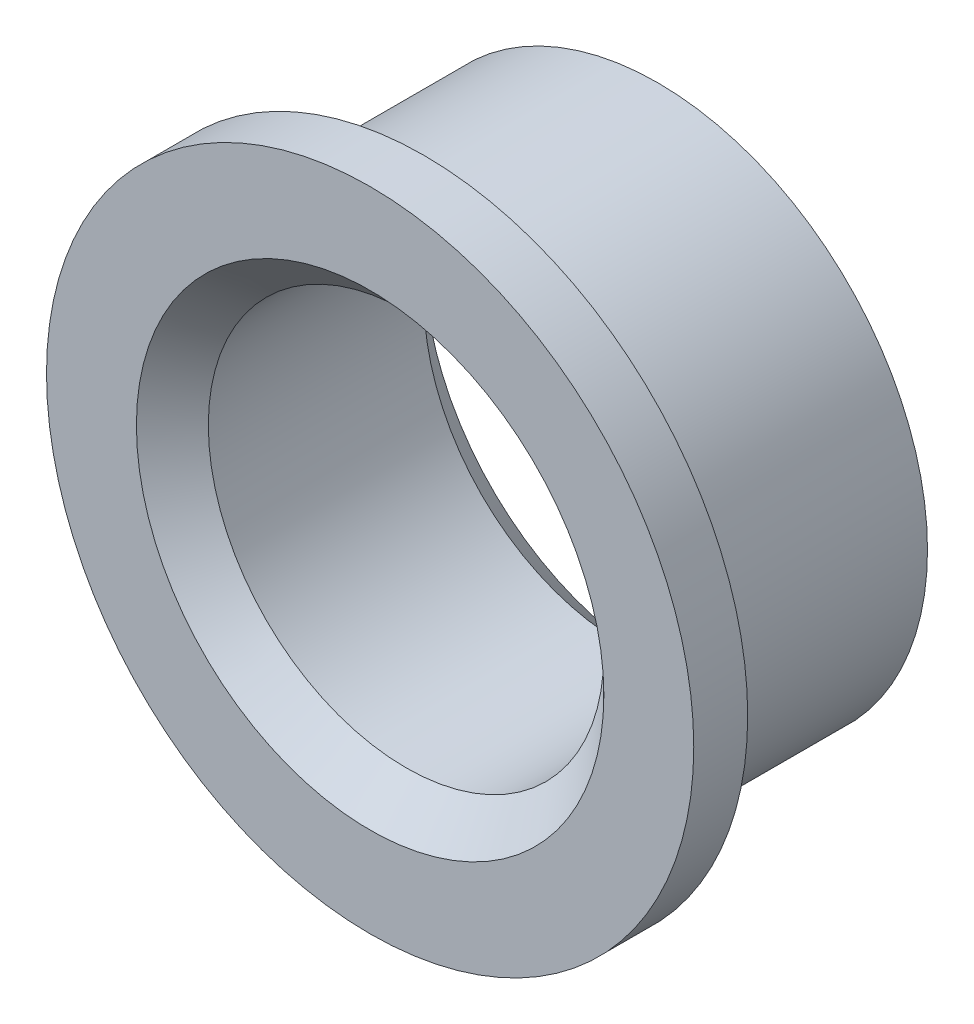
ISO-10303-21;
HEADER;
FILE_DESCRIPTION(('STEP AP214'),'2;1');
FILE_NAME('part.step','',(''),(''),'','','');
FILE_SCHEMA(('AUTOMOTIVE_DESIGN { 1 0 10303 214 1 1 1 1 }'));
ENDSEC;
DATA;
#1=APPLICATION_CONTEXT('core data for automotive mechanical design processes');
#2=APPLICATION_PROTOCOL_DEFINITION('international standard','automotive_design',2000,#1);
#3=PRODUCT_CONTEXT('',#1,'mechanical');
#4=PRODUCT('Part','Part','',(#3));
#5=PRODUCT_RELATED_PRODUCT_CATEGORY('part','',(#4));
#6=PRODUCT_DEFINITION_FORMATION('','',#4);
#7=PRODUCT_DEFINITION_CONTEXT('part definition',#1,'design');
#8=PRODUCT_DEFINITION('design','',#6,#7);
#9=PRODUCT_DEFINITION_SHAPE('','',#8);
#10=(LENGTH_UNIT() NAMED_UNIT(*) SI_UNIT(.MILLI.,.METRE.));
#11=(NAMED_UNIT(*) PLANE_ANGLE_UNIT() SI_UNIT($,.RADIAN.));
#12=(NAMED_UNIT(*) SI_UNIT($,.STERADIAN.) SOLID_ANGLE_UNIT());
#13=UNCERTAINTY_MEASURE_WITH_UNIT(LENGTH_MEASURE(1.E-05),#10,'distance_accuracy_value','');
#14=(GEOMETRIC_REPRESENTATION_CONTEXT(3) GLOBAL_UNCERTAINTY_ASSIGNED_CONTEXT((#13)) GLOBAL_UNIT_ASSIGNED_CONTEXT((#10,
#11,#12)) REPRESENTATION_CONTEXT('',''));
#15=CARTESIAN_POINT('',(0.,0.,0.));
#16=DIRECTION('',(0.,0.,1.));
#17=DIRECTION('',(1.,0.,0.));
#18=AXIS2_PLACEMENT_3D('',#15,#16,#17);
#19=CARTESIAN_POINT('',(0.,7.5,-8.));
#20=DIRECTION('',(0.,0.,1.));
#21=DIRECTION('',(1.,0.,0.));
#22=AXIS2_PLACEMENT_3D('',#19,#20,#21);
#23=PLANE('',#22);
#24=CARTESIAN_POINT('',(0.,0.,-8.));
#25=DIRECTION('',(0.,0.,1.));
#26=DIRECTION('',(1.,0.,0.));
#27=AXIS2_PLACEMENT_3D('',#24,#25,#26);
#28=CIRCLE('',#27,6.5);
#29=CARTESIAN_POINT('',(6.5,0.,-8.));
#30=VERTEX_POINT('',#29);
#31=EDGE_CURVE('E60',#30,#30,#28,.T.);
#32=ORIENTED_EDGE('',*,*,#31,.T.);
#33=EDGE_LOOP('',(#32));
#34=FACE_BOUND('',#33,.T.);
#35=CARTESIAN_POINT('',(0.,0.,-8.));
#36=DIRECTION('',(0.,0.,1.));
#37=DIRECTION('',(1.,0.,0.));
#38=AXIS2_PLACEMENT_3D('',#35,#36,#37);
#39=CIRCLE('',#38,7.5);
#40=CARTESIAN_POINT('',(7.5,0.,-8.));
#41=VERTEX_POINT('',#40);
#42=EDGE_CURVE('E78',#41,#41,#39,.T.);
#43=ORIENTED_EDGE('',*,*,#42,.F.);
#44=EDGE_LOOP('',(#43));
#45=FACE_BOUND('',#44,.T.);
#46=ADVANCED_FACE('F41',(#34,#45),#23,.F.);
#47=CARTESIAN_POINT('',(0.,0.,0.));
#48=DIRECTION('',(0.,0.,1.));
#49=DIRECTION('',(1.,0.,0.));
#50=AXIS2_PLACEMENT_3D('',#47,#48,#49);
#51=CYLINDRICAL_SURFACE('',#50,5.5);
#52=CARTESIAN_POINT('',(0.,0.,-6.99999999999999));
#53=DIRECTION('',(0.,0.,1.));
#54=DIRECTION('',(1.,0.,0.));
#55=AXIS2_PLACEMENT_3D('',#52,#53,#54);
#56=CIRCLE('',#55,5.5);
#57=CARTESIAN_POINT('',(5.5,0.,-6.99999999999999));
#58=VERTEX_POINT('',#57);
#59=EDGE_CURVE('E50',#58,#58,#56,.F.);
#60=ORIENTED_EDGE('',*,*,#59,.T.);
#61=EDGE_LOOP('',(#60));
#62=FACE_BOUND('',#61,.T.);
#63=CARTESIAN_POINT('',(0.,0.,-1.));
#64=DIRECTION('',(0.,0.,-1.));
#65=DIRECTION('',(-1.,0.,0.));
#66=AXIS2_PLACEMENT_3D('',#63,#64,#65);
#67=CIRCLE('',#66,5.5);
#68=CARTESIAN_POINT('',(-5.5,0.,-1.));
#69=VERTEX_POINT('',#68);
#70=EDGE_CURVE('E55',#69,#69,#67,.F.);
#71=ORIENTED_EDGE('',*,*,#70,.T.);
#72=EDGE_LOOP('',(#71));
#73=FACE_BOUND('',#72,.T.);
#74=ADVANCED_FACE('F86',(#62,#73),#51,.F.);
#75=CARTESIAN_POINT('',(0.,5.5,0.));
#76=DIRECTION('',(0.,0.,-1.));
#77=DIRECTION('',(-1.,0.,0.));
#78=AXIS2_PLACEMENT_3D('',#75,#76,#77);
#79=PLANE('',#78);
#80=CARTESIAN_POINT('',(0.,0.,0.));
#81=DIRECTION('',(0.,0.,-1.));
#82=DIRECTION('',(-1.,0.,0.));
#83=AXIS2_PLACEMENT_3D('',#80,#81,#82);
#84=CIRCLE('',#83,6.5);
#85=CARTESIAN_POINT('',(-6.5,0.,0.));
#86=VERTEX_POINT('',#85);
#87=EDGE_CURVE('E10',#86,#86,#84,.T.);
#88=ORIENTED_EDGE('',*,*,#87,.T.);
#89=EDGE_LOOP('',(#88));
#90=FACE_BOUND('',#89,.T.);
#91=CARTESIAN_POINT('',(0.,0.,0.));
#92=DIRECTION('',(0.,0.,1.));
#93=DIRECTION('',(1.,0.,0.));
#94=AXIS2_PLACEMENT_3D('',#91,#92,#93);
#95=CIRCLE('',#94,9.);
#96=CARTESIAN_POINT('',(9.,0.,0.));
#97=VERTEX_POINT('',#96);
#98=EDGE_CURVE('E66',#97,#97,#95,.T.);
#99=ORIENTED_EDGE('',*,*,#98,.T.);
#100=EDGE_LOOP('',(#99));
#101=FACE_BOUND('',#100,.T.);
#102=ADVANCED_FACE('F92',(#90,#101),#79,.F.);
#103=CARTESIAN_POINT('',(0.,0.,0.));
#104=DIRECTION('',(0.,0.,1.));
#105=DIRECTION('',(1.,0.,0.));
#106=AXIS2_PLACEMENT_3D('',#103,#104,#105);
#107=CYLINDRICAL_SURFACE('',#106,9.);
#108=ORIENTED_EDGE('',*,*,#98,.F.);
#109=EDGE_LOOP('',(#108));
#110=FACE_BOUND('',#109,.T.);
#111=CARTESIAN_POINT('',(0.,0.,-1.5));
#112=DIRECTION('',(0.,0.,1.));
#113=DIRECTION('',(1.,0.,0.));
#114=AXIS2_PLACEMENT_3D('',#111,#112,#113);
#115=CIRCLE('',#114,9.);
#116=CARTESIAN_POINT('',(9.,0.,-1.5));
#117=VERTEX_POINT('',#116);
#118=EDGE_CURVE('E70',#117,#117,#115,.T.);
#119=ORIENTED_EDGE('',*,*,#118,.T.);
#120=EDGE_LOOP('',(#119));
#121=FACE_BOUND('',#120,.T.);
#122=ADVANCED_FACE('F114',(#110,#121),#107,.T.);
#123=CARTESIAN_POINT('',(0.,9.,-1.5));
#124=DIRECTION('',(0.,0.,1.));
#125=DIRECTION('',(1.,0.,0.));
#126=AXIS2_PLACEMENT_3D('',#123,#124,#125);
#127=PLANE('',#126);
#128=ORIENTED_EDGE('',*,*,#118,.F.);
#129=EDGE_LOOP('',(#128));
#130=FACE_BOUND('',#129,.T.);
#131=CARTESIAN_POINT('',(0.,0.,-1.5));
#132=DIRECTION('',(0.,0.,1.));
#133=DIRECTION('',(1.,0.,0.));
#134=AXIS2_PLACEMENT_3D('',#131,#132,#133);
#135=CIRCLE('',#134,7.5);
#136=CARTESIAN_POINT('',(7.5,0.,-1.5));
#137=VERTEX_POINT('',#136);
#138=EDGE_CURVE('E74',#137,#137,#135,.T.);
#139=ORIENTED_EDGE('',*,*,#138,.T.);
#140=EDGE_LOOP('',(#139));
#141=FACE_BOUND('',#140,.T.);
#142=ADVANCED_FACE('F106',(#130,#141),#127,.F.);
#143=CARTESIAN_POINT('',(0.,0.,0.));
#144=DIRECTION('',(0.,0.,1.));
#145=DIRECTION('',(1.,0.,0.));
#146=AXIS2_PLACEMENT_3D('',#143,#144,#145);
#147=CYLINDRICAL_SURFACE('',#146,7.5);
#148=ORIENTED_EDGE('',*,*,#138,.F.);
#149=EDGE_LOOP('',(#148));
#150=FACE_BOUND('',#149,.T.);
#151=ORIENTED_EDGE('',*,*,#42,.T.);
#152=EDGE_LOOP('',(#151));
#153=FACE_BOUND('',#152,.T.);
#154=ADVANCED_FACE('F83',(#150,#153),#147,.T.);
#155=CARTESIAN_POINT('',(0.,0.,-8.));
#156=DIRECTION('',(0.,0.,-1.));
#157=DIRECTION('',(-1.,0.,0.));
#158=AXIS2_PLACEMENT_3D('',#155,#156,#157);
#159=CONICAL_SURFACE('',#158,6.5,0.785398163397447);
#160=ORIENTED_EDGE('',*,*,#59,.F.);
#161=EDGE_LOOP('',(#160));
#162=FACE_BOUND('',#161,.T.);
#163=ORIENTED_EDGE('',*,*,#31,.F.);
#164=EDGE_LOOP('',(#163));
#165=FACE_BOUND('',#164,.T.);
#166=ADVANCED_FACE('F96',(#162,#165),#159,.F.);
#167=CARTESIAN_POINT('',(0.,0.,-1.));
#168=DIRECTION('',(0.,0.,1.));
#169=DIRECTION('',(1.,0.,0.));
#170=AXIS2_PLACEMENT_3D('',#167,#168,#169);
#171=CONICAL_SURFACE('',#170,5.5,0.785398163397449);
#172=ORIENTED_EDGE('',*,*,#87,.F.);
#173=EDGE_LOOP('',(#172));
#174=FACE_BOUND('',#173,.T.);
#175=ORIENTED_EDGE('',*,*,#70,.F.);
#176=EDGE_LOOP('',(#175));
#177=FACE_BOUND('',#176,.T.);
#178=ADVANCED_FACE('F44',(#174,#177),#171,.F.);
#179=CLOSED_SHELL('',(#46,#74,#102,#122,#142,#154,#166,#178));
#180=MANIFOLD_SOLID_BREP('B2',#179);
#181=ADVANCED_BREP_SHAPE_REPRESENTATION('',(#18,#180),#14);
#182=SHAPE_DEFINITION_REPRESENTATION(#9,#181);
ENDSEC;
END-ISO-10303-21;
